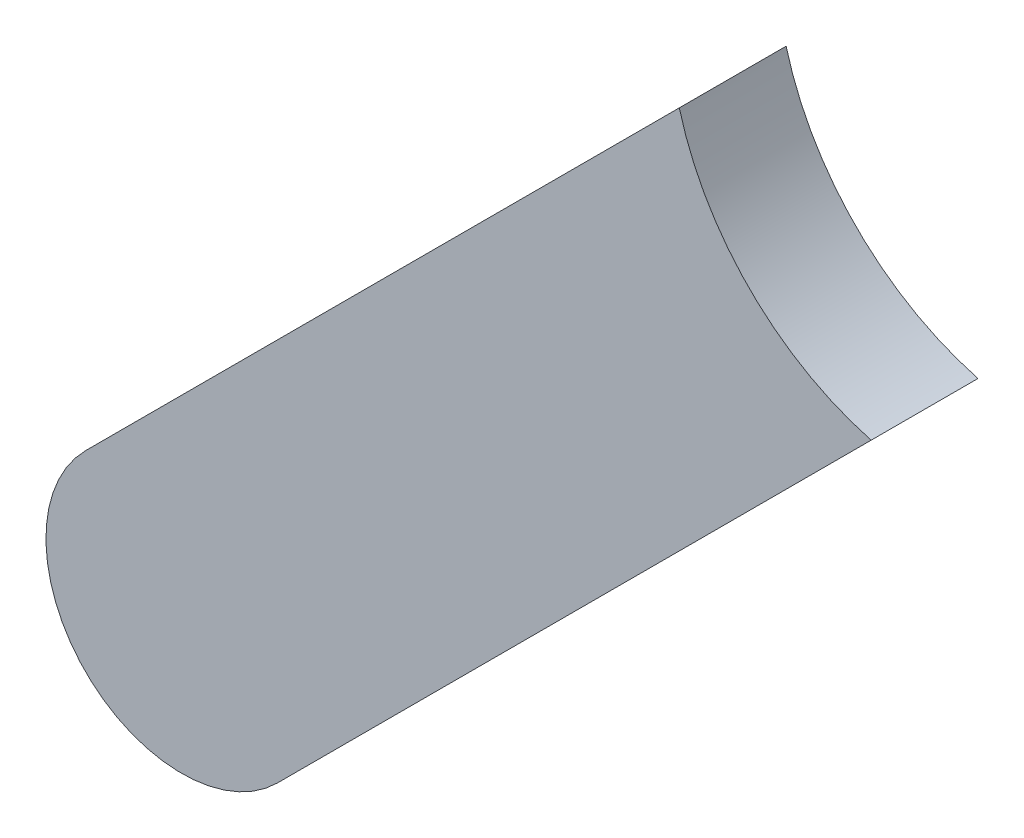
ISO-10303-21;
HEADER;
FILE_DESCRIPTION(('STEP AP214'),'2;1');
FILE_NAME('part.step','',(''),(''),'','','');
FILE_SCHEMA(('AUTOMOTIVE_DESIGN { 1 0 10303 214 1 1 1 1 }'));
ENDSEC;
DATA;
#1=APPLICATION_CONTEXT('core data for automotive mechanical design processes');
#2=APPLICATION_PROTOCOL_DEFINITION('international standard','automotive_design',2000,#1);
#3=PRODUCT_CONTEXT('',#1,'mechanical');
#4=PRODUCT('Part','Part','',(#3));
#5=PRODUCT_RELATED_PRODUCT_CATEGORY('part','',(#4));
#6=PRODUCT_DEFINITION_FORMATION('','',#4);
#7=PRODUCT_DEFINITION_CONTEXT('part definition',#1,'design');
#8=PRODUCT_DEFINITION('design','',#6,#7);
#9=PRODUCT_DEFINITION_SHAPE('','',#8);
#10=(LENGTH_UNIT() NAMED_UNIT(*) SI_UNIT(.MILLI.,.METRE.));
#11=(NAMED_UNIT(*) PLANE_ANGLE_UNIT() SI_UNIT($,.RADIAN.));
#12=(NAMED_UNIT(*) SI_UNIT($,.STERADIAN.) SOLID_ANGLE_UNIT());
#13=UNCERTAINTY_MEASURE_WITH_UNIT(LENGTH_MEASURE(1.E-05),#10,'distance_accuracy_value','');
#14=(GEOMETRIC_REPRESENTATION_CONTEXT(3) GLOBAL_UNCERTAINTY_ASSIGNED_CONTEXT((#13)) GLOBAL_UNIT_ASSIGNED_CONTEXT((#10,
#11,#12)) REPRESENTATION_CONTEXT('',''));
#15=CARTESIAN_POINT('',(0.,0.,0.));
#16=DIRECTION('',(0.,0.,1.));
#17=DIRECTION('',(1.,0.,0.));
#18=AXIS2_PLACEMENT_3D('',#15,#16,#17);
#19=CARTESIAN_POINT('',(103.02420594,116.38099406,0.));
#20=DIRECTION('',(-0.707106781186544,0.707106781186551,0.));
#21=DIRECTION('',(0.707106781186551,0.707106781186544,0.));
#22=AXIS2_PLACEMENT_3D('',#19,#20,#21);
#23=PLANE('',#22);
#24=DIRECTION('',(0.707106781186551,0.707106781186544,0.));
#25=VECTOR('',#24,1.);
#26=CARTESIAN_POINT('',(103.02420594,116.38099406,0.1999996));
#27=LINE('',#26,#25);
#28=CARTESIAN_POINT('',(103.02420594,116.38099406,0.1999996));
#29=VERTEX_POINT('',#28);
#30=CARTESIAN_POINT('',(104.135521214697,117.492309334697,0.1999996));
#31=VERTEX_POINT('',#30);
#32=EDGE_CURVE('E11',#29,#31,#27,.T.);
#33=ORIENTED_EDGE('',*,*,#32,.F.);
#34=DIRECTION('',(0.,0.,1.));
#35=VECTOR('',#34,1.);
#36=CARTESIAN_POINT('',(103.02420594,116.38099406,0.));
#37=LINE('',#36,#35);
#38=CARTESIAN_POINT('',(103.02420594,116.38099406,0.));
#39=VERTEX_POINT('',#38);
#40=EDGE_CURVE('E24',#39,#29,#37,.T.);
#41=ORIENTED_EDGE('',*,*,#40,.F.);
#42=DIRECTION('',(0.707106781186551,0.707106781186544,0.));
#43=VECTOR('',#42,1.);
#44=CARTESIAN_POINT('',(103.02420594,116.38099406,0.));
#45=LINE('',#44,#43);
#46=CARTESIAN_POINT('',(104.135521214697,117.492309334697,0.));
#47=VERTEX_POINT('',#46);
#48=EDGE_CURVE('E75',#39,#47,#45,.T.);
#49=ORIENTED_EDGE('',*,*,#48,.T.);
#50=DIRECTION('',(0.,0.,1.));
#51=VECTOR('',#50,1.);
#52=CARTESIAN_POINT('',(104.135521214697,117.492309334697,0.));
#53=LINE('',#52,#51);
#54=EDGE_CURVE('E37',#47,#31,#53,.T.);
#55=ORIENTED_EDGE('',*,*,#54,.T.);
#56=EDGE_LOOP('',(#33,#41,#49,#55));
#57=FACE_BOUND('',#56,.T.);
#58=ADVANCED_FACE('F17',(#57),#23,.F.);
#59=CARTESIAN_POINT('',(104.267,117.983,0.));
#60=DIRECTION('',(0.,0.,-1.));
#61=DIRECTION('',(1.,0.,0.));
#62=AXIS2_PLACEMENT_3D('',#59,#60,#61);
#63=CYLINDRICAL_SURFACE('',#62,0.508);
#64=DIRECTION('',(0.,0.,1.));
#65=VECTOR('',#64,1.);
#66=CARTESIAN_POINT('',(103.776309334697,117.851521214697,0.));
#67=LINE('',#66,#65);
#68=CARTESIAN_POINT('',(103.776309334697,117.851521214697,0.));
#69=VERTEX_POINT('',#68);
#70=CARTESIAN_POINT('',(103.776309334697,117.851521214697,0.1999996));
#71=VERTEX_POINT('',#70);
#72=EDGE_CURVE('E67',#69,#71,#67,.T.);
#73=ORIENTED_EDGE('',*,*,#72,.T.);
#74=CARTESIAN_POINT('',(104.267,117.983,0.1999996));
#75=DIRECTION('',(0.,0.,1.));
#76=DIRECTION('',(1.,0.,0.));
#77=AXIS2_PLACEMENT_3D('',#74,#75,#76);
#78=CIRCLE('',#77,0.508);
#79=EDGE_CURVE('E82',#71,#31,#78,.T.);
#80=ORIENTED_EDGE('',*,*,#79,.T.);
#81=ORIENTED_EDGE('',*,*,#54,.F.);
#82=CARTESIAN_POINT('',(104.267,117.983,0.));
#83=DIRECTION('',(0.,0.,1.));
#84=DIRECTION('',(1.,0.,0.));
#85=AXIS2_PLACEMENT_3D('',#82,#83,#84);
#86=CIRCLE('',#85,0.508);
#87=EDGE_CURVE('E80',#69,#47,#86,.T.);
#88=ORIENTED_EDGE('',*,*,#87,.F.);
#89=EDGE_LOOP('',(#73,#80,#81,#88));
#90=FACE_BOUND('',#89,.T.);
#91=ADVANCED_FACE('F88',(#90),#63,.F.);
#92=CARTESIAN_POINT('',(103.776309334697,117.851521214697,0.));
#93=DIRECTION('',(0.707106781186548,-0.707106781186548,0.));
#94=DIRECTION('',(-0.707106781186548,-0.707106781186548,0.));
#95=AXIS2_PLACEMENT_3D('',#92,#93,#94);
#96=PLANE('',#95);
#97=DIRECTION('',(-0.707106781186548,-0.707106781186548,0.));
#98=VECTOR('',#97,1.);
#99=CARTESIAN_POINT('',(104.08739406,118.16260594,0.1999996));
#100=LINE('',#99,#98);
#101=CARTESIAN_POINT('',(102.66499406,116.74020594,0.1999996));
#102=VERTEX_POINT('',#101);
#103=EDGE_CURVE('E71',#71,#102,#100,.T.);
#104=ORIENTED_EDGE('',*,*,#103,.F.);
#105=ORIENTED_EDGE('',*,*,#72,.F.);
#106=DIRECTION('',(-0.707106781186548,-0.707106781186548,0.));
#107=VECTOR('',#106,1.);
#108=CARTESIAN_POINT('',(104.08739406,118.16260594,0.));
#109=LINE('',#108,#107);
#110=CARTESIAN_POINT('',(102.66499406,116.74020594,0.));
#111=VERTEX_POINT('',#110);
#112=EDGE_CURVE('E63',#69,#111,#109,.T.);
#113=ORIENTED_EDGE('',*,*,#112,.T.);
#114=DIRECTION('',(0.,0.,1.));
#115=VECTOR('',#114,1.);
#116=CARTESIAN_POINT('',(102.66499406,116.74020594,0.));
#117=LINE('',#116,#115);
#118=EDGE_CURVE('E53',#111,#102,#117,.T.);
#119=ORIENTED_EDGE('',*,*,#118,.T.);
#120=EDGE_LOOP('',(#104,#105,#113,#119));
#121=FACE_BOUND('',#120,.T.);
#122=ADVANCED_FACE('F66',(#121),#96,.F.);
#123=CARTESIAN_POINT('',(102.8446,116.5606,0.));
#124=DIRECTION('',(0.,0.,-1.));
#125=DIRECTION('',(-0.70710678118652,0.707106781186576,0.));
#126=AXIS2_PLACEMENT_3D('',#123,#124,#125);
#127=CYLINDRICAL_SURFACE('',#126,0.254001156230764);
#128=CARTESIAN_POINT('',(102.8446,116.5606,0.1999996));
#129=DIRECTION('',(0.,0.,1.));
#130=DIRECTION('',(-0.70710678118652,0.707106781186576,0.));
#131=AXIS2_PLACEMENT_3D('',#128,#129,#130);
#132=CIRCLE('',#131,0.254001156230764);
#133=EDGE_CURVE('E59',#102,#29,#132,.T.);
#134=ORIENTED_EDGE('',*,*,#133,.F.);
#135=ORIENTED_EDGE('',*,*,#118,.F.);
#136=CARTESIAN_POINT('',(102.8446,116.5606,0.));
#137=DIRECTION('',(0.,0.,1.));
#138=DIRECTION('',(-0.70710678118652,0.707106781186576,0.));
#139=AXIS2_PLACEMENT_3D('',#136,#137,#138);
#140=CIRCLE('',#139,0.254001156230764);
#141=EDGE_CURVE('E57',#111,#39,#140,.T.);
#142=ORIENTED_EDGE('',*,*,#141,.T.);
#143=ORIENTED_EDGE('',*,*,#40,.T.);
#144=EDGE_LOOP('',(#134,#135,#142,#143));
#145=FACE_BOUND('',#144,.T.);
#146=ADVANCED_FACE('F55',(#145),#127,.T.);
#147=CARTESIAN_POINT('',(103.02420594,116.38099406,0.));
#148=DIRECTION('',(0.,0.,-1.));
#149=DIRECTION('',(-1.,0.,0.));
#150=AXIS2_PLACEMENT_3D('',#147,#148,#149);
#151=PLANE('',#150);
#152=ORIENTED_EDGE('',*,*,#48,.F.);
#153=ORIENTED_EDGE('',*,*,#141,.F.);
#154=ORIENTED_EDGE('',*,*,#112,.F.);
#155=ORIENTED_EDGE('',*,*,#87,.T.);
#156=EDGE_LOOP('',(#152,#153,#154,#155));
#157=FACE_BOUND('',#156,.T.);
#158=ADVANCED_FACE('F74',(#157),#151,.T.);
#159=CARTESIAN_POINT('',(103.02420594,116.38099406,0.1999996));
#160=DIRECTION('',(0.,0.,-1.));
#161=DIRECTION('',(-1.,0.,0.));
#162=AXIS2_PLACEMENT_3D('',#159,#160,#161);
#163=PLANE('',#162);
#164=ORIENTED_EDGE('',*,*,#133,.T.);
#165=ORIENTED_EDGE('',*,*,#32,.T.);
#166=ORIENTED_EDGE('',*,*,#79,.F.);
#167=ORIENTED_EDGE('',*,*,#103,.T.);
#168=EDGE_LOOP('',(#164,#165,#166,#167));
#169=FACE_BOUND('',#168,.T.);
#170=ADVANCED_FACE('F91',(#169),#163,.F.);
#171=CLOSED_SHELL('',(#58,#91,#122,#146,#158,#170));
#172=MANIFOLD_SOLID_BREP('B1',#171);
#173=ADVANCED_BREP_SHAPE_REPRESENTATION('',(#18,#172),#14);
#174=SHAPE_DEFINITION_REPRESENTATION(#9,#173);
ENDSEC;
END-ISO-10303-21;
